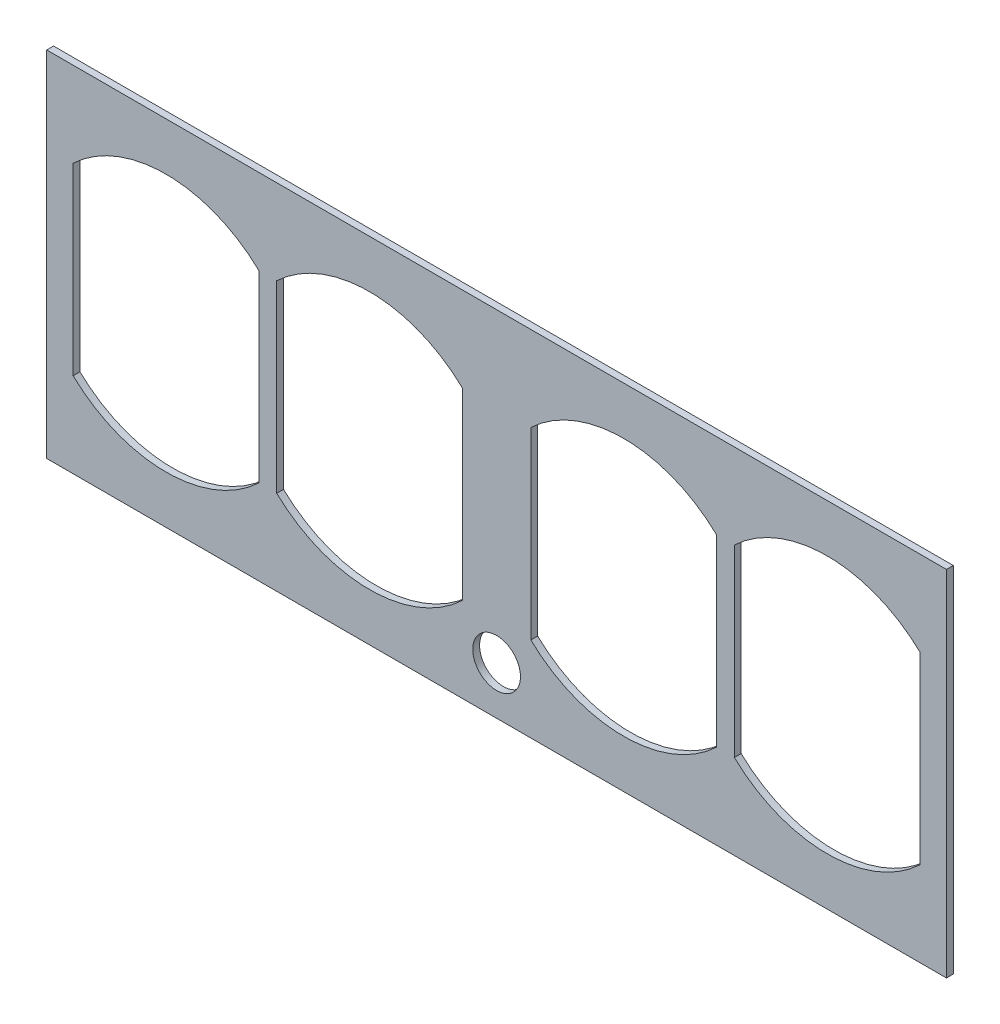
ISO-10303-21;
HEADER;
FILE_DESCRIPTION(('STEP AP214'),'2;1');
FILE_NAME('part.step','',(''),(''),'','','');
FILE_SCHEMA(('AUTOMOTIVE_DESIGN { 1 0 10303 214 1 1 1 1 }'));
ENDSEC;
DATA;
#1=APPLICATION_CONTEXT('core data for automotive mechanical design processes');
#2=APPLICATION_PROTOCOL_DEFINITION('international standard','automotive_design',2000,#1);
#3=PRODUCT_CONTEXT('',#1,'mechanical');
#4=PRODUCT('Part','Part','',(#3));
#5=PRODUCT_RELATED_PRODUCT_CATEGORY('part','',(#4));
#6=PRODUCT_DEFINITION_FORMATION('','',#4);
#7=PRODUCT_DEFINITION_CONTEXT('part definition',#1,'design');
#8=PRODUCT_DEFINITION('design','',#6,#7);
#9=PRODUCT_DEFINITION_SHAPE('','',#8);
#10=(LENGTH_UNIT() NAMED_UNIT(*) SI_UNIT(.MILLI.,.METRE.));
#11=(NAMED_UNIT(*) PLANE_ANGLE_UNIT() SI_UNIT($,.RADIAN.));
#12=(NAMED_UNIT(*) SI_UNIT($,.STERADIAN.) SOLID_ANGLE_UNIT());
#13=UNCERTAINTY_MEASURE_WITH_UNIT(LENGTH_MEASURE(1.E-05),#10,'distance_accuracy_value','');
#14=(GEOMETRIC_REPRESENTATION_CONTEXT(3) GLOBAL_UNCERTAINTY_ASSIGNED_CONTEXT((#13)) GLOBAL_UNIT_ASSIGNED_CONTEXT((#10,
#11,#12)) REPRESENTATION_CONTEXT('',''));
#15=CARTESIAN_POINT('',(0.,0.,0.));
#16=DIRECTION('',(0.,0.,1.));
#17=DIRECTION('',(1.,0.,0.));
#18=AXIS2_PLACEMENT_3D('',#15,#16,#17);
#19=CARTESIAN_POINT('',(0.,0.,0.8));
#20=DIRECTION('',(0.,0.,1.));
#21=DIRECTION('',(1.,0.,0.));
#22=AXIS2_PLACEMENT_3D('',#19,#20,#21);
#23=PLANE('',#22);
#24=DIRECTION('',(0.,-1.,0.));
#25=VECTOR('',#24,1.);
#26=CARTESIAN_POINT('',(4.1027706576709,10.7772546197146,0.8));
#27=LINE('',#26,#25);
#28=CARTESIAN_POINT('',(4.1027706576709,10.7772546197146,0.8));
#29=VERTEX_POINT('',#28);
#30=CARTESIAN_POINT('',(4.10277065767091,-10.8327453802854,0.8));
#31=VERTEX_POINT('',#30);
#32=EDGE_CURVE('E216',#29,#31,#27,.T.);
#33=ORIENTED_EDGE('',*,*,#32,.F.);
#34=CARTESIAN_POINT('',(15.0027706576709,-0.722282204221043,0.8));
#35=DIRECTION('',(0.,0.,1.));
#36=DIRECTION('',(1.,0.,0.));
#37=AXIS2_PLACEMENT_3D('',#34,#35,#36);
#38=CIRCLE('',#37,15.8445368239356);
#39=CARTESIAN_POINT('',(25.9027706576709,10.7772546197146,0.8));
#40=VERTEX_POINT('',#39);
#41=EDGE_CURVE('E214',#40,#29,#38,.T.);
#42=ORIENTED_EDGE('',*,*,#41,.F.);
#43=DIRECTION('',(0.,1.,0.));
#44=VECTOR('',#43,1.);
#45=CARTESIAN_POINT('',(25.9027706576709,10.7772546197146,0.8));
#46=LINE('',#45,#44);
#47=CARTESIAN_POINT('',(25.9027706576709,-10.8327453802854,0.8));
#48=VERTEX_POINT('',#47);
#49=EDGE_CURVE('E222',#48,#40,#46,.T.);
#50=ORIENTED_EDGE('',*,*,#49,.F.);
#51=CARTESIAN_POINT('',(15.0027706576709,0.666791443650245,0.8));
#52=DIRECTION('',(0.,0.,1.));
#53=DIRECTION('',(-1.,0.,0.));
#54=AXIS2_PLACEMENT_3D('',#51,#52,#53);
#55=CIRCLE('',#54,15.8445368239356);
#56=EDGE_CURVE('E219',#31,#48,#55,.T.);
#57=ORIENTED_EDGE('',*,*,#56,.F.);
#58=EDGE_LOOP('',(#33,#42,#50,#57));
#59=FACE_BOUND('',#58,.T.);
#60=DIRECTION('',(0.,1.,0.));
#61=VECTOR('',#60,1.);
#62=CARTESIAN_POINT('',(-27.8358774133697,10.7772546197146,0.8));
#63=LINE('',#62,#61);
#64=CARTESIAN_POINT('',(-27.8358774133697,-10.8327453802854,0.8));
#65=VERTEX_POINT('',#64);
#66=CARTESIAN_POINT('',(-27.8358774133697,10.7772546197146,0.8));
#67=VERTEX_POINT('',#66);
#68=EDGE_CURVE('E247',#65,#67,#63,.T.);
#69=ORIENTED_EDGE('',*,*,#68,.F.);
#70=CARTESIAN_POINT('',(-38.7358774133698,0.666791443650253,0.8));
#71=DIRECTION('',(0.,0.,1.));
#72=DIRECTION('',(1.,0.,0.));
#73=AXIS2_PLACEMENT_3D('',#70,#71,#72);
#74=CIRCLE('',#73,15.8445368239357);
#75=CARTESIAN_POINT('',(-49.6358774133698,-10.8327453802855,0.8));
#76=VERTEX_POINT('',#75);
#77=EDGE_CURVE('E245',#76,#65,#74,.T.);
#78=ORIENTED_EDGE('',*,*,#77,.F.);
#79=DIRECTION('',(0.,-1.,0.));
#80=VECTOR('',#79,1.);
#81=CARTESIAN_POINT('',(-49.6358774133698,10.7772546197146,0.8));
#82=LINE('',#81,#80);
#83=CARTESIAN_POINT('',(-49.6358774133698,10.7772546197146,0.8));
#84=VERTEX_POINT('',#83);
#85=EDGE_CURVE('E253',#84,#76,#82,.T.);
#86=ORIENTED_EDGE('',*,*,#85,.F.);
#87=CARTESIAN_POINT('',(-38.7358774133698,-0.722282204221076,0.8));
#88=DIRECTION('',(0.,0.,1.));
#89=DIRECTION('',(-1.,0.,0.));
#90=AXIS2_PLACEMENT_3D('',#87,#88,#89);
#91=CIRCLE('',#90,15.8445368239357);
#92=EDGE_CURVE('E250',#67,#84,#91,.T.);
#93=ORIENTED_EDGE('',*,*,#92,.F.);
#94=EDGE_LOOP('',(#69,#78,#86,#93));
#95=FACE_BOUND('',#94,.T.);
#96=DIRECTION('',(0.,1.,0.));
#97=VECTOR('',#96,1.);
#98=CARTESIAN_POINT('',(-3.9358774133698,10.7772546197146,0.8));
#99=LINE('',#98,#97);
#100=CARTESIAN_POINT('',(-3.9358774133698,-10.8327453802854,0.8));
#101=VERTEX_POINT('',#100);
#102=CARTESIAN_POINT('',(-3.9358774133698,10.7772546197146,0.8));
#103=VERTEX_POINT('',#102);
#104=EDGE_CURVE('E278',#101,#103,#99,.T.);
#105=ORIENTED_EDGE('',*,*,#104,.F.);
#106=CARTESIAN_POINT('',(-14.8358774133698,0.666791443650241,0.8));
#107=DIRECTION('',(0.,0.,1.));
#108=DIRECTION('',(1.,0.,0.));
#109=AXIS2_PLACEMENT_3D('',#106,#107,#108);
#110=CIRCLE('',#109,15.8445368239356);
#111=CARTESIAN_POINT('',(-25.7358774133698,-10.8327453802854,0.8));
#112=VERTEX_POINT('',#111);
#113=EDGE_CURVE('E276',#112,#101,#110,.T.);
#114=ORIENTED_EDGE('',*,*,#113,.F.);
#115=DIRECTION('',(0.,-1.,0.));
#116=VECTOR('',#115,1.);
#117=CARTESIAN_POINT('',(-25.7358774133698,10.7772546197146,0.8));
#118=LINE('',#117,#116);
#119=CARTESIAN_POINT('',(-25.7358774133698,10.7772546197146,0.8));
#120=VERTEX_POINT('',#119);
#121=EDGE_CURVE('E284',#120,#112,#118,.T.);
#122=ORIENTED_EDGE('',*,*,#121,.F.);
#123=CARTESIAN_POINT('',(-14.8358774133698,-0.722282204221047,0.8));
#124=DIRECTION('',(0.,0.,1.));
#125=DIRECTION('',(-1.,0.,0.));
#126=AXIS2_PLACEMENT_3D('',#123,#124,#125);
#127=CIRCLE('',#126,15.8445368239356);
#128=EDGE_CURVE('E281',#103,#120,#127,.T.);
#129=ORIENTED_EDGE('',*,*,#128,.F.);
#130=EDGE_LOOP('',(#105,#114,#122,#129));
#131=FACE_BOUND('',#130,.T.);
#132=DIRECTION('',(0.,1.,0.));
#133=VECTOR('',#132,1.);
#134=CARTESIAN_POINT('',(52.9036610168809,20.7454029966093,0.8));
#135=LINE('',#134,#133);
#136=CARTESIAN_POINT('',(52.9036610168809,-20.8008937571798,0.8));
#137=VERTEX_POINT('',#136);
#138=CARTESIAN_POINT('',(52.9036610168809,20.7454029966093,0.8));
#139=VERTEX_POINT('',#138);
#140=EDGE_CURVE('E307',#137,#139,#135,.T.);
#141=ORIENTED_EDGE('',*,*,#140,.T.);
#142=DIRECTION('',(-1.,0.,0.));
#143=VECTOR('',#142,1.);
#144=CARTESIAN_POINT('',(-52.7367677725798,20.7454029966093,0.8));
#145=LINE('',#144,#143);
#146=CARTESIAN_POINT('',(-52.7367677725798,20.7454029966093,0.8));
#147=VERTEX_POINT('',#146);
#148=EDGE_CURVE('E310',#139,#147,#145,.T.);
#149=ORIENTED_EDGE('',*,*,#148,.T.);
#150=DIRECTION('',(0.,-1.,0.));
#151=VECTOR('',#150,1.);
#152=CARTESIAN_POINT('',(-52.7367677725798,20.7454029966093,0.8));
#153=LINE('',#152,#151);
#154=CARTESIAN_POINT('',(-52.7367677725798,-20.8008937571798,0.8));
#155=VERTEX_POINT('',#154);
#156=EDGE_CURVE('E313',#147,#155,#153,.T.);
#157=ORIENTED_EDGE('',*,*,#156,.T.);
#158=DIRECTION('',(1.,0.,0.));
#159=VECTOR('',#158,1.);
#160=CARTESIAN_POINT('',(-52.7367677725798,-20.8008937571798,0.8));
#161=LINE('',#160,#159);
#162=EDGE_CURVE('E315',#155,#137,#161,.T.);
#163=ORIENTED_EDGE('',*,*,#162,.T.);
#164=EDGE_LOOP('',(#141,#149,#157,#163));
#165=FACE_BOUND('',#164,.T.);
#166=CARTESIAN_POINT('',(0.0834466221505551,-15.1777453802852,0.8));
#167=DIRECTION('',(0.,0.,1.));
#168=DIRECTION('',(1.,0.,0.));
#169=AXIS2_PLACEMENT_3D('',#166,#167,#168);
#170=CIRCLE('',#169,2.8);
#171=CARTESIAN_POINT('',(2.88344662215056,-15.1777453802852,0.8));
#172=VERTEX_POINT('',#171);
#173=EDGE_CURVE('E208',#172,#172,#170,.T.);
#174=ORIENTED_EDGE('',*,*,#173,.F.);
#175=EDGE_LOOP('',(#174));
#176=FACE_BOUND('',#175,.T.);
#177=DIRECTION('',(0.,-1.,0.));
#178=VECTOR('',#177,1.);
#179=CARTESIAN_POINT('',(28.0027706576708,10.7772546197146,0.8));
#180=LINE('',#179,#178);
#181=CARTESIAN_POINT('',(28.0027706576708,10.7772546197146,0.8));
#182=VERTEX_POINT('',#181);
#183=CARTESIAN_POINT('',(28.0027706576708,-10.8327453802854,0.8));
#184=VERTEX_POINT('',#183);
#185=EDGE_CURVE('E180',#182,#184,#180,.T.);
#186=ORIENTED_EDGE('',*,*,#185,.F.);
#187=CARTESIAN_POINT('',(38.9027706576709,-0.722282204221067,0.8));
#188=DIRECTION('',(0.,0.,1.));
#189=DIRECTION('',(1.,0.,0.));
#190=AXIS2_PLACEMENT_3D('',#187,#188,#189);
#191=CIRCLE('',#190,15.8445368239357);
#192=CARTESIAN_POINT('',(49.8027706576709,10.7772546197146,0.8));
#193=VERTEX_POINT('',#192);
#194=EDGE_CURVE('E172',#193,#182,#191,.T.);
#195=ORIENTED_EDGE('',*,*,#194,.F.);
#196=DIRECTION('',(0.,1.,0.));
#197=VECTOR('',#196,1.);
#198=CARTESIAN_POINT('',(49.8027706576709,10.7772546197146,0.8));
#199=LINE('',#198,#197);
#200=CARTESIAN_POINT('',(49.8027706576709,-10.8327453802855,0.8));
#201=VERTEX_POINT('',#200);
#202=EDGE_CURVE('E194',#201,#193,#199,.T.);
#203=ORIENTED_EDGE('',*,*,#202,.F.);
#204=CARTESIAN_POINT('',(38.9027706576709,0.666791443650262,0.8));
#205=DIRECTION('',(0.,0.,1.));
#206=DIRECTION('',(-1.,0.,0.));
#207=AXIS2_PLACEMENT_3D('',#204,#205,#206);
#208=CIRCLE('',#207,15.8445368239357);
#209=EDGE_CURVE('E192',#184,#201,#208,.T.);
#210=ORIENTED_EDGE('',*,*,#209,.F.);
#211=EDGE_LOOP('',(#186,#195,#203,#210));
#212=FACE_BOUND('',#211,.T.);
#213=ADVANCED_FACE('F35',(#59,#95,#131,#165,#176,#212),#23,.T.);
#214=CARTESIAN_POINT('',(0.,0.,0.));
#215=DIRECTION('',(0.,0.,1.));
#216=DIRECTION('',(1.,0.,0.));
#217=AXIS2_PLACEMENT_3D('',#214,#215,#216);
#218=PLANE('',#217);
#219=CARTESIAN_POINT('',(0.0834466221505551,-15.1777453802852,0.));
#220=DIRECTION('',(0.,0.,1.));
#221=DIRECTION('',(1.,0.,0.));
#222=AXIS2_PLACEMENT_3D('',#219,#220,#221);
#223=CIRCLE('',#222,2.8);
#224=CARTESIAN_POINT('',(2.88344662215056,-15.1777453802852,0.));
#225=VERTEX_POINT('',#224);
#226=EDGE_CURVE('E188',#225,#225,#223,.T.);
#227=ORIENTED_EDGE('',*,*,#226,.T.);
#228=EDGE_LOOP('',(#227));
#229=FACE_BOUND('',#228,.T.);
#230=CARTESIAN_POINT('',(15.0027706576709,-0.722282204221043,0.));
#231=DIRECTION('',(0.,0.,1.));
#232=DIRECTION('',(1.,0.,0.));
#233=AXIS2_PLACEMENT_3D('',#230,#231,#232);
#234=CIRCLE('',#233,15.8445368239356);
#235=CARTESIAN_POINT('',(25.9027706576709,10.7772546197146,0.));
#236=VERTEX_POINT('',#235);
#237=CARTESIAN_POINT('',(4.1027706576709,10.7772546197146,0.));
#238=VERTEX_POINT('',#237);
#239=EDGE_CURVE('E211',#236,#238,#234,.T.);
#240=ORIENTED_EDGE('',*,*,#239,.T.);
#241=DIRECTION('',(0.,-1.,0.));
#242=VECTOR('',#241,1.);
#243=CARTESIAN_POINT('',(4.1027706576709,10.7772546197146,0.));
#244=LINE('',#243,#242);
#245=CARTESIAN_POINT('',(4.10277065767091,-10.8327453802854,0.));
#246=VERTEX_POINT('',#245);
#247=EDGE_CURVE('E227',#238,#246,#244,.T.);
#248=ORIENTED_EDGE('',*,*,#247,.T.);
#249=CARTESIAN_POINT('',(15.0027706576709,0.666791443650245,0.));
#250=DIRECTION('',(0.,0.,1.));
#251=DIRECTION('',(-1.,0.,0.));
#252=AXIS2_PLACEMENT_3D('',#249,#250,#251);
#253=CIRCLE('',#252,15.8445368239356);
#254=CARTESIAN_POINT('',(25.9027706576709,-10.8327453802854,0.));
#255=VERTEX_POINT('',#254);
#256=EDGE_CURVE('E230',#246,#255,#253,.T.);
#257=ORIENTED_EDGE('',*,*,#256,.T.);
#258=DIRECTION('',(0.,1.,0.));
#259=VECTOR('',#258,1.);
#260=CARTESIAN_POINT('',(25.9027706576709,10.7772546197146,0.));
#261=LINE('',#260,#259);
#262=EDGE_CURVE('E217',#255,#236,#261,.T.);
#263=ORIENTED_EDGE('',*,*,#262,.T.);
#264=EDGE_LOOP('',(#240,#248,#257,#263));
#265=FACE_BOUND('',#264,.T.);
#266=CARTESIAN_POINT('',(-14.8358774133698,0.666791443650241,0.));
#267=DIRECTION('',(0.,0.,1.));
#268=DIRECTION('',(1.,0.,0.));
#269=AXIS2_PLACEMENT_3D('',#266,#267,#268);
#270=CIRCLE('',#269,15.8445368239356);
#271=CARTESIAN_POINT('',(-25.7358774133698,-10.8327453802854,0.));
#272=VERTEX_POINT('',#271);
#273=CARTESIAN_POINT('',(-3.9358774133698,-10.8327453802854,0.));
#274=VERTEX_POINT('',#273);
#275=EDGE_CURVE('E275',#272,#274,#270,.T.);
#276=ORIENTED_EDGE('',*,*,#275,.T.);
#277=DIRECTION('',(0.,1.,0.));
#278=VECTOR('',#277,1.);
#279=CARTESIAN_POINT('',(-3.9358774133698,10.7772546197146,0.));
#280=LINE('',#279,#278);
#281=CARTESIAN_POINT('',(-3.9358774133698,10.7772546197146,0.));
#282=VERTEX_POINT('',#281);
#283=EDGE_CURVE('E289',#274,#282,#280,.T.);
#284=ORIENTED_EDGE('',*,*,#283,.T.);
#285=CARTESIAN_POINT('',(-14.8358774133698,-0.722282204221047,0.));
#286=DIRECTION('',(0.,0.,1.));
#287=DIRECTION('',(-1.,0.,0.));
#288=AXIS2_PLACEMENT_3D('',#285,#286,#287);
#289=CIRCLE('',#288,15.8445368239356);
#290=CARTESIAN_POINT('',(-25.7358774133698,10.7772546197146,0.));
#291=VERTEX_POINT('',#290);
#292=EDGE_CURVE('E292',#282,#291,#289,.T.);
#293=ORIENTED_EDGE('',*,*,#292,.T.);
#294=DIRECTION('',(0.,-1.,0.));
#295=VECTOR('',#294,1.);
#296=CARTESIAN_POINT('',(-25.7358774133698,10.7772546197146,0.));
#297=LINE('',#296,#295);
#298=EDGE_CURVE('E279',#291,#272,#297,.T.);
#299=ORIENTED_EDGE('',*,*,#298,.T.);
#300=EDGE_LOOP('',(#276,#284,#293,#299));
#301=FACE_BOUND('',#300,.T.);
#302=DIRECTION('',(0.,1.,0.));
#303=VECTOR('',#302,1.);
#304=CARTESIAN_POINT('',(52.9036610168809,20.7454029966093,0.));
#305=LINE('',#304,#303);
#306=CARTESIAN_POINT('',(52.9036610168809,-20.8008937571798,0.));
#307=VERTEX_POINT('',#306);
#308=CARTESIAN_POINT('',(52.9036610168809,20.7454029966093,0.));
#309=VERTEX_POINT('',#308);
#310=EDGE_CURVE('E306',#307,#309,#305,.T.);
#311=ORIENTED_EDGE('',*,*,#310,.F.);
#312=DIRECTION('',(1.,0.,0.));
#313=VECTOR('',#312,1.);
#314=CARTESIAN_POINT('',(-52.7367677725798,-20.8008937571798,0.));
#315=LINE('',#314,#313);
#316=CARTESIAN_POINT('',(-52.7367677725798,-20.8008937571798,0.));
#317=VERTEX_POINT('',#316);
#318=EDGE_CURVE('E311',#317,#307,#315,.T.);
#319=ORIENTED_EDGE('',*,*,#318,.F.);
#320=DIRECTION('',(0.,-1.,0.));
#321=VECTOR('',#320,1.);
#322=CARTESIAN_POINT('',(-52.7367677725798,20.7454029966093,0.));
#323=LINE('',#322,#321);
#324=CARTESIAN_POINT('',(-52.7367677725798,20.7454029966093,0.));
#325=VERTEX_POINT('',#324);
#326=EDGE_CURVE('E322',#325,#317,#323,.T.);
#327=ORIENTED_EDGE('',*,*,#326,.F.);
#328=DIRECTION('',(-1.,0.,0.));
#329=VECTOR('',#328,1.);
#330=CARTESIAN_POINT('',(-52.7367677725798,20.7454029966093,0.));
#331=LINE('',#330,#329);
#332=EDGE_CURVE('E320',#309,#325,#331,.T.);
#333=ORIENTED_EDGE('',*,*,#332,.F.);
#334=EDGE_LOOP('',(#311,#319,#327,#333));
#335=FACE_BOUND('',#334,.T.);
#336=CARTESIAN_POINT('',(-38.7358774133698,0.666791443650253,0.));
#337=DIRECTION('',(0.,0.,1.));
#338=DIRECTION('',(1.,0.,0.));
#339=AXIS2_PLACEMENT_3D('',#336,#337,#338);
#340=CIRCLE('',#339,15.8445368239357);
#341=CARTESIAN_POINT('',(-49.6358774133698,-10.8327453802855,0.));
#342=VERTEX_POINT('',#341);
#343=CARTESIAN_POINT('',(-27.8358774133697,-10.8327453802854,0.));
#344=VERTEX_POINT('',#343);
#345=EDGE_CURVE('E244',#342,#344,#340,.T.);
#346=ORIENTED_EDGE('',*,*,#345,.T.);
#347=DIRECTION('',(0.,1.,0.));
#348=VECTOR('',#347,1.);
#349=CARTESIAN_POINT('',(-27.8358774133697,10.7772546197146,0.));
#350=LINE('',#349,#348);
#351=CARTESIAN_POINT('',(-27.8358774133697,10.7772546197146,0.));
#352=VERTEX_POINT('',#351);
#353=EDGE_CURVE('E258',#344,#352,#350,.T.);
#354=ORIENTED_EDGE('',*,*,#353,.T.);
#355=CARTESIAN_POINT('',(-38.7358774133698,-0.722282204221076,0.));
#356=DIRECTION('',(0.,0.,1.));
#357=DIRECTION('',(-1.,0.,0.));
#358=AXIS2_PLACEMENT_3D('',#355,#356,#357);
#359=CIRCLE('',#358,15.8445368239357);
#360=CARTESIAN_POINT('',(-49.6358774133698,10.7772546197146,0.));
#361=VERTEX_POINT('',#360);
#362=EDGE_CURVE('E261',#352,#361,#359,.T.);
#363=ORIENTED_EDGE('',*,*,#362,.T.);
#364=DIRECTION('',(0.,-1.,0.));
#365=VECTOR('',#364,1.);
#366=CARTESIAN_POINT('',(-49.6358774133698,10.7772546197146,0.));
#367=LINE('',#366,#365);
#368=EDGE_CURVE('E248',#361,#342,#367,.T.);
#369=ORIENTED_EDGE('',*,*,#368,.T.);
#370=EDGE_LOOP('',(#346,#354,#363,#369));
#371=FACE_BOUND('',#370,.T.);
#372=CARTESIAN_POINT('',(38.9027706576709,-0.722282204221067,0.));
#373=DIRECTION('',(0.,0.,1.));
#374=DIRECTION('',(1.,0.,0.));
#375=AXIS2_PLACEMENT_3D('',#372,#373,#374);
#376=CIRCLE('',#375,15.8445368239357);
#377=CARTESIAN_POINT('',(49.8027706576709,10.7772546197146,0.));
#378=VERTEX_POINT('',#377);
#379=CARTESIAN_POINT('',(28.0027706576708,10.7772546197146,0.));
#380=VERTEX_POINT('',#379);
#381=EDGE_CURVE('E58',#378,#380,#376,.T.);
#382=ORIENTED_EDGE('',*,*,#381,.T.);
#383=DIRECTION('',(0.,-1.,0.));
#384=VECTOR('',#383,1.);
#385=CARTESIAN_POINT('',(28.0027706576708,10.7772546197146,0.));
#386=LINE('',#385,#384);
#387=CARTESIAN_POINT('',(28.0027706576708,-10.8327453802854,0.));
#388=VERTEX_POINT('',#387);
#389=EDGE_CURVE('E187',#380,#388,#386,.T.);
#390=ORIENTED_EDGE('',*,*,#389,.T.);
#391=CARTESIAN_POINT('',(38.9027706576709,0.666791443650262,0.));
#392=DIRECTION('',(0.,0.,1.));
#393=DIRECTION('',(-1.,0.,0.));
#394=AXIS2_PLACEMENT_3D('',#391,#392,#393);
#395=CIRCLE('',#394,15.8445368239357);
#396=CARTESIAN_POINT('',(49.8027706576709,-10.8327453802855,0.));
#397=VERTEX_POINT('',#396);
#398=EDGE_CURVE('E200',#388,#397,#395,.T.);
#399=ORIENTED_EDGE('',*,*,#398,.T.);
#400=DIRECTION('',(0.,1.,0.));
#401=VECTOR('',#400,1.);
#402=CARTESIAN_POINT('',(49.8027706576709,10.7772546197146,0.));
#403=LINE('',#402,#401);
#404=EDGE_CURVE('E181',#397,#378,#403,.T.);
#405=ORIENTED_EDGE('',*,*,#404,.T.);
#406=EDGE_LOOP('',(#382,#390,#399,#405));
#407=FACE_BOUND('',#406,.T.);
#408=ADVANCED_FACE('F340',(#229,#265,#301,#335,#371,#407),#218,.F.);
#409=CARTESIAN_POINT('',(52.9036610168809,20.7454029966093,0.8));
#410=DIRECTION('',(-1.,0.,0.));
#411=DIRECTION('',(0.,0.,1.));
#412=AXIS2_PLACEMENT_3D('',#409,#410,#411);
#413=PLANE('',#412);
#414=ORIENTED_EDGE('',*,*,#310,.T.);
#415=DIRECTION('',(0.,0.,-1.));
#416=VECTOR('',#415,1.);
#417=CARTESIAN_POINT('',(52.9036610168809,20.7454029966093,0.8));
#418=LINE('',#417,#416);
#419=EDGE_CURVE('E11',#139,#309,#418,.T.);
#420=ORIENTED_EDGE('',*,*,#419,.F.);
#421=ORIENTED_EDGE('',*,*,#140,.F.);
#422=DIRECTION('',(0.,0.,-1.));
#423=VECTOR('',#422,1.);
#424=CARTESIAN_POINT('',(52.9036610168809,-20.8008937571798,0.8));
#425=LINE('',#424,#423);
#426=EDGE_CURVE('E317',#137,#307,#425,.T.);
#427=ORIENTED_EDGE('',*,*,#426,.T.);
#428=EDGE_LOOP('',(#414,#420,#421,#427));
#429=FACE_BOUND('',#428,.T.);
#430=ADVANCED_FACE('F37',(#429),#413,.F.);
#431=CARTESIAN_POINT('',(-52.7367677725798,20.7454029966093,0.8));
#432=DIRECTION('',(0.,-1.,0.));
#433=DIRECTION('',(0.,0.,-1.));
#434=AXIS2_PLACEMENT_3D('',#431,#432,#433);
#435=PLANE('',#434);
#436=ORIENTED_EDGE('',*,*,#332,.T.);
#437=DIRECTION('',(0.,0.,-1.));
#438=VECTOR('',#437,1.);
#439=CARTESIAN_POINT('',(-52.7367677725798,20.7454029966093,0.8));
#440=LINE('',#439,#438);
#441=EDGE_CURVE('E43',#147,#325,#440,.T.);
#442=ORIENTED_EDGE('',*,*,#441,.F.);
#443=ORIENTED_EDGE('',*,*,#148,.F.);
#444=ORIENTED_EDGE('',*,*,#419,.T.);
#445=EDGE_LOOP('',(#436,#442,#443,#444));
#446=FACE_BOUND('',#445,.T.);
#447=ADVANCED_FACE('F351',(#446),#435,.F.);
#448=CARTESIAN_POINT('',(-52.7367677725798,20.7454029966093,0.8));
#449=DIRECTION('',(1.,0.,0.));
#450=DIRECTION('',(0.,0.,-1.));
#451=AXIS2_PLACEMENT_3D('',#448,#449,#450);
#452=PLANE('',#451);
#453=ORIENTED_EDGE('',*,*,#326,.T.);
#454=DIRECTION('',(0.,0.,-1.));
#455=VECTOR('',#454,1.);
#456=CARTESIAN_POINT('',(-52.7367677725798,-20.8008937571798,0.8));
#457=LINE('',#456,#455);
#458=EDGE_CURVE('E327',#155,#317,#457,.T.);
#459=ORIENTED_EDGE('',*,*,#458,.F.);
#460=ORIENTED_EDGE('',*,*,#156,.F.);
#461=ORIENTED_EDGE('',*,*,#441,.T.);
#462=EDGE_LOOP('',(#453,#459,#460,#461));
#463=FACE_BOUND('',#462,.T.);
#464=ADVANCED_FACE('F334',(#463),#452,.F.);
#465=CARTESIAN_POINT('',(-52.7367677725798,-20.8008937571798,0.8));
#466=DIRECTION('',(0.,1.,0.));
#467=DIRECTION('',(0.,0.,1.));
#468=AXIS2_PLACEMENT_3D('',#465,#466,#467);
#469=PLANE('',#468);
#470=ORIENTED_EDGE('',*,*,#318,.T.);
#471=ORIENTED_EDGE('',*,*,#426,.F.);
#472=ORIENTED_EDGE('',*,*,#162,.F.);
#473=ORIENTED_EDGE('',*,*,#458,.T.);
#474=EDGE_LOOP('',(#470,#471,#472,#473));
#475=FACE_BOUND('',#474,.T.);
#476=ADVANCED_FACE('F344',(#475),#469,.F.);
#477=CARTESIAN_POINT('',(-14.8358774133698,0.666791443650241,0.8));
#478=DIRECTION('',(0.,0.,-1.));
#479=DIRECTION('',(-1.,0.,0.));
#480=AXIS2_PLACEMENT_3D('',#477,#478,#479);
#481=CYLINDRICAL_SURFACE('',#480,15.8445368239356);
#482=ORIENTED_EDGE('',*,*,#275,.F.);
#483=DIRECTION('',(0.,0.,-1.));
#484=VECTOR('',#483,1.);
#485=CARTESIAN_POINT('',(-25.7358774133698,-10.8327453802854,0.8));
#486=LINE('',#485,#484);
#487=EDGE_CURVE('E286',#112,#272,#486,.T.);
#488=ORIENTED_EDGE('',*,*,#487,.F.);
#489=ORIENTED_EDGE('',*,*,#113,.T.);
#490=DIRECTION('',(0.,0.,-1.));
#491=VECTOR('',#490,1.);
#492=CARTESIAN_POINT('',(-3.9358774133698,-10.8327453802854,0.8));
#493=LINE('',#492,#491);
#494=EDGE_CURVE('E303',#101,#274,#493,.T.);
#495=ORIENTED_EDGE('',*,*,#494,.T.);
#496=EDGE_LOOP('',(#482,#488,#489,#495));
#497=FACE_BOUND('',#496,.T.);
#498=ADVANCED_FACE('F369',(#497),#481,.F.);
#499=CARTESIAN_POINT('',(-3.9358774133698,10.7772546197146,0.8));
#500=DIRECTION('',(-1.,0.,0.));
#501=DIRECTION('',(0.,0.,1.));
#502=AXIS2_PLACEMENT_3D('',#499,#500,#501);
#503=PLANE('',#502);
#504=ORIENTED_EDGE('',*,*,#283,.F.);
#505=ORIENTED_EDGE('',*,*,#494,.F.);
#506=ORIENTED_EDGE('',*,*,#104,.T.);
#507=DIRECTION('',(0.,0.,-1.));
#508=VECTOR('',#507,1.);
#509=CARTESIAN_POINT('',(-3.9358774133698,10.7772546197146,0.8));
#510=LINE('',#509,#508);
#511=EDGE_CURVE('E301',#103,#282,#510,.T.);
#512=ORIENTED_EDGE('',*,*,#511,.T.);
#513=EDGE_LOOP('',(#504,#505,#506,#512));
#514=FACE_BOUND('',#513,.T.);
#515=ADVANCED_FACE('F376',(#514),#503,.T.);
#516=CARTESIAN_POINT('',(-14.8358774133698,-0.722282204221047,0.8));
#517=DIRECTION('',(0.,0.,-1.));
#518=DIRECTION('',(-1.,0.,0.));
#519=AXIS2_PLACEMENT_3D('',#516,#517,#518);
#520=CYLINDRICAL_SURFACE('',#519,15.8445368239356);
#521=ORIENTED_EDGE('',*,*,#292,.F.);
#522=ORIENTED_EDGE('',*,*,#511,.F.);
#523=ORIENTED_EDGE('',*,*,#128,.T.);
#524=DIRECTION('',(0.,0.,-1.));
#525=VECTOR('',#524,1.);
#526=CARTESIAN_POINT('',(-25.7358774133698,10.7772546197146,0.8));
#527=LINE('',#526,#525);
#528=EDGE_CURVE('E299',#120,#291,#527,.T.);
#529=ORIENTED_EDGE('',*,*,#528,.T.);
#530=EDGE_LOOP('',(#521,#522,#523,#529));
#531=FACE_BOUND('',#530,.T.);
#532=ADVANCED_FACE('F381',(#531),#520,.F.);
#533=CARTESIAN_POINT('',(-25.7358774133698,10.7772546197146,0.8));
#534=DIRECTION('',(1.,0.,0.));
#535=DIRECTION('',(0.,1.,0.));
#536=AXIS2_PLACEMENT_3D('',#533,#534,#535);
#537=PLANE('',#536);
#538=ORIENTED_EDGE('',*,*,#298,.F.);
#539=ORIENTED_EDGE('',*,*,#528,.F.);
#540=ORIENTED_EDGE('',*,*,#121,.T.);
#541=ORIENTED_EDGE('',*,*,#487,.T.);
#542=EDGE_LOOP('',(#538,#539,#540,#541));
#543=FACE_BOUND('',#542,.T.);
#544=ADVANCED_FACE('F389',(#543),#537,.T.);
#545=CARTESIAN_POINT('',(-38.7358774133698,0.666791443650253,0.8));
#546=DIRECTION('',(0.,0.,-1.));
#547=DIRECTION('',(-1.,0.,0.));
#548=AXIS2_PLACEMENT_3D('',#545,#546,#547);
#549=CYLINDRICAL_SURFACE('',#548,15.8445368239357);
#550=ORIENTED_EDGE('',*,*,#345,.F.);
#551=DIRECTION('',(0.,0.,-1.));
#552=VECTOR('',#551,1.);
#553=CARTESIAN_POINT('',(-49.6358774133698,-10.8327453802855,0.8));
#554=LINE('',#553,#552);
#555=EDGE_CURVE('E255',#76,#342,#554,.T.);
#556=ORIENTED_EDGE('',*,*,#555,.F.);
#557=ORIENTED_EDGE('',*,*,#77,.T.);
#558=DIRECTION('',(0.,0.,-1.));
#559=VECTOR('',#558,1.);
#560=CARTESIAN_POINT('',(-27.8358774133697,-10.8327453802854,0.8));
#561=LINE('',#560,#559);
#562=EDGE_CURVE('E272',#65,#344,#561,.T.);
#563=ORIENTED_EDGE('',*,*,#562,.T.);
#564=EDGE_LOOP('',(#550,#556,#557,#563));
#565=FACE_BOUND('',#564,.T.);
#566=ADVANCED_FACE('F402',(#565),#549,.F.);
#567=CARTESIAN_POINT('',(-27.8358774133697,10.7772546197146,0.8));
#568=DIRECTION('',(-1.,0.,0.));
#569=DIRECTION('',(0.,-1.,0.));
#570=AXIS2_PLACEMENT_3D('',#567,#568,#569);
#571=PLANE('',#570);
#572=ORIENTED_EDGE('',*,*,#353,.F.);
#573=ORIENTED_EDGE('',*,*,#562,.F.);
#574=ORIENTED_EDGE('',*,*,#68,.T.);
#575=DIRECTION('',(0.,0.,-1.));
#576=VECTOR('',#575,1.);
#577=CARTESIAN_POINT('',(-27.8358774133697,10.7772546197146,0.8));
#578=LINE('',#577,#576);
#579=EDGE_CURVE('E270',#67,#352,#578,.T.);
#580=ORIENTED_EDGE('',*,*,#579,.T.);
#581=EDGE_LOOP('',(#572,#573,#574,#580));
#582=FACE_BOUND('',#581,.T.);
#583=ADVANCED_FACE('F407',(#582),#571,.T.);
#584=CARTESIAN_POINT('',(-38.7358774133698,-0.722282204221076,0.8));
#585=DIRECTION('',(0.,0.,-1.));
#586=DIRECTION('',(-1.,0.,0.));
#587=AXIS2_PLACEMENT_3D('',#584,#585,#586);
#588=CYLINDRICAL_SURFACE('',#587,15.8445368239357);
#589=ORIENTED_EDGE('',*,*,#362,.F.);
#590=ORIENTED_EDGE('',*,*,#579,.F.);
#591=ORIENTED_EDGE('',*,*,#92,.T.);
#592=DIRECTION('',(0.,0.,-1.));
#593=VECTOR('',#592,1.);
#594=CARTESIAN_POINT('',(-49.6358774133698,10.7772546197146,0.8));
#595=LINE('',#594,#593);
#596=EDGE_CURVE('E268',#84,#361,#595,.T.);
#597=ORIENTED_EDGE('',*,*,#596,.T.);
#598=EDGE_LOOP('',(#589,#590,#591,#597));
#599=FACE_BOUND('',#598,.T.);
#600=ADVANCED_FACE('F411',(#599),#588,.F.);
#601=CARTESIAN_POINT('',(-49.6358774133698,10.7772546197146,0.8));
#602=DIRECTION('',(1.,0.,0.));
#603=DIRECTION('',(0.,1.,0.));
#604=AXIS2_PLACEMENT_3D('',#601,#602,#603);
#605=PLANE('',#604);
#606=ORIENTED_EDGE('',*,*,#368,.F.);
#607=ORIENTED_EDGE('',*,*,#596,.F.);
#608=ORIENTED_EDGE('',*,*,#85,.T.);
#609=ORIENTED_EDGE('',*,*,#555,.T.);
#610=EDGE_LOOP('',(#606,#607,#608,#609));
#611=FACE_BOUND('',#610,.T.);
#612=ADVANCED_FACE('F415',(#611),#605,.T.);
#613=CARTESIAN_POINT('',(15.0027706576709,-0.722282204221043,0.8));
#614=DIRECTION('',(0.,0.,-1.));
#615=DIRECTION('',(-1.,0.,0.));
#616=AXIS2_PLACEMENT_3D('',#613,#614,#615);
#617=CYLINDRICAL_SURFACE('',#616,15.8445368239356);
#618=ORIENTED_EDGE('',*,*,#239,.F.);
#619=DIRECTION('',(0.,0.,-1.));
#620=VECTOR('',#619,1.);
#621=CARTESIAN_POINT('',(25.9027706576709,10.7772546197146,0.8));
#622=LINE('',#621,#620);
#623=EDGE_CURVE('E224',#40,#236,#622,.T.);
#624=ORIENTED_EDGE('',*,*,#623,.F.);
#625=ORIENTED_EDGE('',*,*,#41,.T.);
#626=DIRECTION('',(0.,0.,-1.));
#627=VECTOR('',#626,1.);
#628=CARTESIAN_POINT('',(4.1027706576709,10.7772546197146,0.8));
#629=LINE('',#628,#627);
#630=EDGE_CURVE('E241',#29,#238,#629,.T.);
#631=ORIENTED_EDGE('',*,*,#630,.T.);
#632=EDGE_LOOP('',(#618,#624,#625,#631));
#633=FACE_BOUND('',#632,.T.);
#634=ADVANCED_FACE('F419',(#633),#617,.F.);
#635=CARTESIAN_POINT('',(4.1027706576709,10.7772546197146,0.8));
#636=DIRECTION('',(1.,0.,0.));
#637=DIRECTION('',(0.,1.,0.));
#638=AXIS2_PLACEMENT_3D('',#635,#636,#637);
#639=PLANE('',#638);
#640=ORIENTED_EDGE('',*,*,#247,.F.);
#641=ORIENTED_EDGE('',*,*,#630,.F.);
#642=ORIENTED_EDGE('',*,*,#32,.T.);
#643=DIRECTION('',(0.,0.,-1.));
#644=VECTOR('',#643,1.);
#645=CARTESIAN_POINT('',(4.10277065767091,-10.8327453802854,0.8));
#646=LINE('',#645,#644);
#647=EDGE_CURVE('E239',#31,#246,#646,.T.);
#648=ORIENTED_EDGE('',*,*,#647,.T.);
#649=EDGE_LOOP('',(#640,#641,#642,#648));
#650=FACE_BOUND('',#649,.T.);
#651=ADVANCED_FACE('F423',(#650),#639,.T.);
#652=CARTESIAN_POINT('',(15.0027706576709,0.666791443650245,0.8));
#653=DIRECTION('',(0.,0.,-1.));
#654=DIRECTION('',(-1.,0.,0.));
#655=AXIS2_PLACEMENT_3D('',#652,#653,#654);
#656=CYLINDRICAL_SURFACE('',#655,15.8445368239356);
#657=ORIENTED_EDGE('',*,*,#256,.F.);
#658=ORIENTED_EDGE('',*,*,#647,.F.);
#659=ORIENTED_EDGE('',*,*,#56,.T.);
#660=DIRECTION('',(0.,0.,-1.));
#661=VECTOR('',#660,1.);
#662=CARTESIAN_POINT('',(25.9027706576709,-10.8327453802854,0.8));
#663=LINE('',#662,#661);
#664=EDGE_CURVE('E237',#48,#255,#663,.T.);
#665=ORIENTED_EDGE('',*,*,#664,.T.);
#666=EDGE_LOOP('',(#657,#658,#659,#665));
#667=FACE_BOUND('',#666,.T.);
#668=ADVANCED_FACE('F427',(#667),#656,.F.);
#669=CARTESIAN_POINT('',(25.9027706576709,10.7772546197146,0.8));
#670=DIRECTION('',(-1.,0.,0.));
#671=DIRECTION('',(0.,-1.,0.));
#672=AXIS2_PLACEMENT_3D('',#669,#670,#671);
#673=PLANE('',#672);
#674=ORIENTED_EDGE('',*,*,#262,.F.);
#675=ORIENTED_EDGE('',*,*,#664,.F.);
#676=ORIENTED_EDGE('',*,*,#49,.T.);
#677=ORIENTED_EDGE('',*,*,#623,.T.);
#678=EDGE_LOOP('',(#674,#675,#676,#677));
#679=FACE_BOUND('',#678,.T.);
#680=ADVANCED_FACE('F431',(#679),#673,.T.);
#681=CARTESIAN_POINT('',(0.0834466221505551,-15.1777453802852,0.8));
#682=DIRECTION('',(0.,0.,-1.));
#683=DIRECTION('',(-1.,0.,0.));
#684=AXIS2_PLACEMENT_3D('',#681,#682,#683);
#685=CYLINDRICAL_SURFACE('',#684,2.8);
#686=ORIENTED_EDGE('',*,*,#173,.T.);
#687=EDGE_LOOP('',(#686));
#688=FACE_BOUND('',#687,.T.);
#689=ORIENTED_EDGE('',*,*,#226,.F.);
#690=EDGE_LOOP('',(#689));
#691=FACE_BOUND('',#690,.T.);
#692=ADVANCED_FACE('F435',(#688,#691),#685,.F.);
#693=CARTESIAN_POINT('',(38.9027706576709,-0.722282204221067,0.8));
#694=DIRECTION('',(0.,0.,-1.));
#695=DIRECTION('',(-1.,0.,0.));
#696=AXIS2_PLACEMENT_3D('',#693,#694,#695);
#697=CYLINDRICAL_SURFACE('',#696,15.8445368239357);
#698=ORIENTED_EDGE('',*,*,#381,.F.);
#699=DIRECTION('',(0.,0.,-1.));
#700=VECTOR('',#699,1.);
#701=CARTESIAN_POINT('',(49.8027706576709,10.7772546197146,0.8));
#702=LINE('',#701,#700);
#703=EDGE_CURVE('E176',#193,#378,#702,.T.);
#704=ORIENTED_EDGE('',*,*,#703,.F.);
#705=ORIENTED_EDGE('',*,*,#194,.T.);
#706=DIRECTION('',(0.,0.,-1.));
#707=VECTOR('',#706,1.);
#708=CARTESIAN_POINT('',(28.0027706576708,10.7772546197146,0.8));
#709=LINE('',#708,#707);
#710=EDGE_CURVE('E175',#182,#380,#709,.T.);
#711=ORIENTED_EDGE('',*,*,#710,.T.);
#712=EDGE_LOOP('',(#698,#704,#705,#711));
#713=FACE_BOUND('',#712,.T.);
#714=ADVANCED_FACE('F174',(#713),#697,.F.);
#715=CARTESIAN_POINT('',(28.0027706576708,10.7772546197146,0.8));
#716=DIRECTION('',(1.,0.,0.));
#717=DIRECTION('',(0.,1.,0.));
#718=AXIS2_PLACEMENT_3D('',#715,#716,#717);
#719=PLANE('',#718);
#720=ORIENTED_EDGE('',*,*,#389,.F.);
#721=ORIENTED_EDGE('',*,*,#710,.F.);
#722=ORIENTED_EDGE('',*,*,#185,.T.);
#723=DIRECTION('',(0.,0.,-1.));
#724=VECTOR('',#723,1.);
#725=CARTESIAN_POINT('',(28.0027706576708,-10.8327453802854,0.8));
#726=LINE('',#725,#724);
#727=EDGE_CURVE('E189',#184,#388,#726,.T.);
#728=ORIENTED_EDGE('',*,*,#727,.T.);
#729=EDGE_LOOP('',(#720,#721,#722,#728));
#730=FACE_BOUND('',#729,.T.);
#731=ADVANCED_FACE('F184',(#730),#719,.T.);
#732=CARTESIAN_POINT('',(38.9027706576709,0.666791443650262,0.8));
#733=DIRECTION('',(0.,0.,-1.));
#734=DIRECTION('',(-1.,0.,0.));
#735=AXIS2_PLACEMENT_3D('',#732,#733,#734);
#736=CYLINDRICAL_SURFACE('',#735,15.8445368239357);
#737=ORIENTED_EDGE('',*,*,#398,.F.);
#738=ORIENTED_EDGE('',*,*,#727,.F.);
#739=ORIENTED_EDGE('',*,*,#209,.T.);
#740=DIRECTION('',(0.,0.,-1.));
#741=VECTOR('',#740,1.);
#742=CARTESIAN_POINT('',(49.8027706576709,-10.8327453802855,0.8));
#743=LINE('',#742,#741);
#744=EDGE_CURVE('E50',#201,#397,#743,.T.);
#745=ORIENTED_EDGE('',*,*,#744,.T.);
#746=EDGE_LOOP('',(#737,#738,#739,#745));
#747=FACE_BOUND('',#746,.T.);
#748=ADVANCED_FACE('F444',(#747),#736,.F.);
#749=CARTESIAN_POINT('',(49.8027706576709,10.7772546197146,0.8));
#750=DIRECTION('',(-1.,0.,0.));
#751=DIRECTION('',(0.,-1.,0.));
#752=AXIS2_PLACEMENT_3D('',#749,#750,#751);
#753=PLANE('',#752);
#754=ORIENTED_EDGE('',*,*,#404,.F.);
#755=ORIENTED_EDGE('',*,*,#744,.F.);
#756=ORIENTED_EDGE('',*,*,#202,.T.);
#757=ORIENTED_EDGE('',*,*,#703,.T.);
#758=EDGE_LOOP('',(#754,#755,#756,#757));
#759=FACE_BOUND('',#758,.T.);
#760=ADVANCED_FACE('F447',(#759),#753,.T.);
#761=CLOSED_SHELL('',(#213,#408,#430,#447,#464,#476,#498,#515,#532,#544,#566,#583,#600,#612,
#634,#651,#668,#680,#692,#714,#731,#748,#760));
#762=MANIFOLD_SOLID_BREP('B2',#761);
#763=ADVANCED_BREP_SHAPE_REPRESENTATION('',(#18,#762),#14);
#764=SHAPE_DEFINITION_REPRESENTATION(#9,#763);
ENDSEC;
END-ISO-10303-21;
